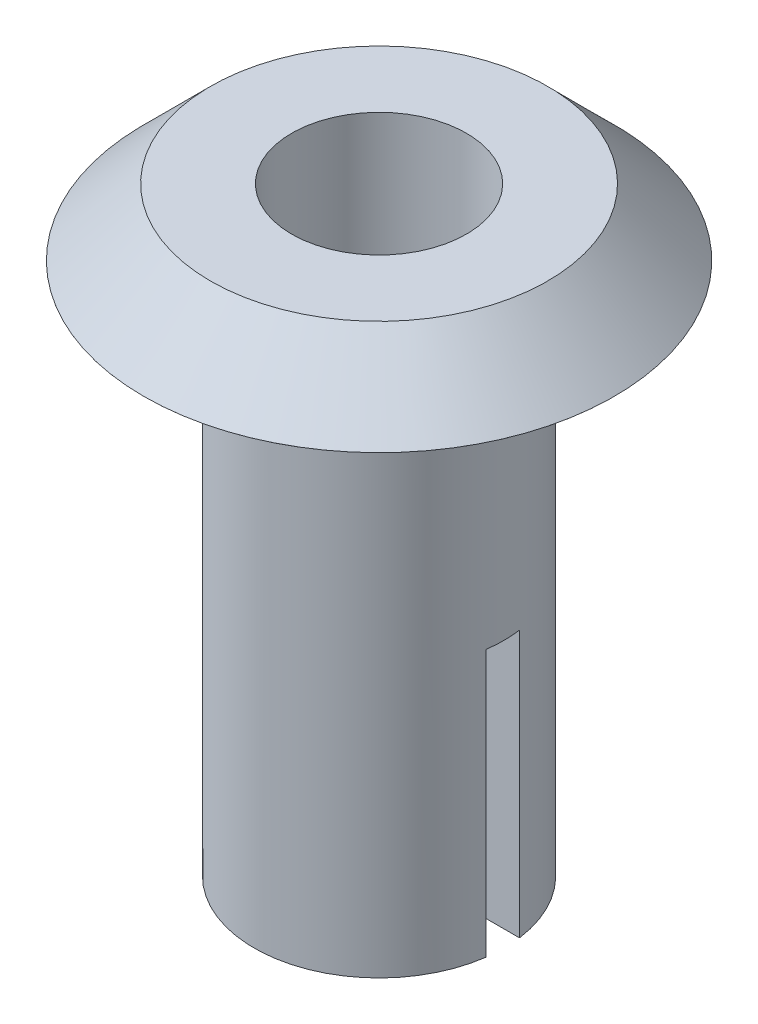
ISO-10303-21;
HEADER;
FILE_DESCRIPTION(('STEP AP214'),'2;1');
FILE_NAME('part.step','',(''),(''),'','','');
FILE_SCHEMA(('AUTOMOTIVE_DESIGN { 1 0 10303 214 1 1 1 1 }'));
ENDSEC;
DATA;
#1=APPLICATION_CONTEXT('core data for automotive mechanical design processes');
#2=APPLICATION_PROTOCOL_DEFINITION('international standard','automotive_design',2000,#1);
#3=PRODUCT_CONTEXT('',#1,'mechanical');
#4=PRODUCT('Part','Part','',(#3));
#5=PRODUCT_RELATED_PRODUCT_CATEGORY('part','',(#4));
#6=PRODUCT_DEFINITION_FORMATION('','',#4);
#7=PRODUCT_DEFINITION_CONTEXT('part definition',#1,'design');
#8=PRODUCT_DEFINITION('design','',#6,#7);
#9=PRODUCT_DEFINITION_SHAPE('','',#8);
#10=(LENGTH_UNIT() NAMED_UNIT(*) SI_UNIT(.MILLI.,.METRE.));
#11=(NAMED_UNIT(*) PLANE_ANGLE_UNIT() SI_UNIT($,.RADIAN.));
#12=(NAMED_UNIT(*) SI_UNIT($,.STERADIAN.) SOLID_ANGLE_UNIT());
#13=UNCERTAINTY_MEASURE_WITH_UNIT(LENGTH_MEASURE(1.E-05),#10,'distance_accuracy_value','');
#14=(GEOMETRIC_REPRESENTATION_CONTEXT(3) GLOBAL_UNCERTAINTY_ASSIGNED_CONTEXT((#13)) GLOBAL_UNIT_ASSIGNED_CONTEXT((#10,
#11,#12)) REPRESENTATION_CONTEXT('',''));
#15=CARTESIAN_POINT('',(0.,0.,0.));
#16=DIRECTION('',(0.,0.,1.));
#17=DIRECTION('',(1.,0.,0.));
#18=AXIS2_PLACEMENT_3D('',#15,#16,#17);
#19=CARTESIAN_POINT('',(0.,0.,0.));
#20=DIRECTION('',(0.,1.,0.));
#21=DIRECTION('',(0.,0.,1.));
#22=AXIS2_PLACEMENT_3D('',#19,#20,#21);
#23=PLANE('',#22);
#24=CARTESIAN_POINT('',(0.,0.,0.));
#25=DIRECTION('',(0.,1.,0.));
#26=DIRECTION('',(0.,0.,1.));
#27=AXIS2_PLACEMENT_3D('',#24,#25,#26);
#28=CIRCLE('',#27,1.5);
#29=CARTESIAN_POINT('',(1.48660687473185,0.,-0.2));
#30=VERTEX_POINT('',#29);
#31=CARTESIAN_POINT('',(-1.48660687473185,0.,-0.2));
#32=VERTEX_POINT('',#31);
#33=EDGE_CURVE('E131',#30,#32,#28,.T.);
#34=ORIENTED_EDGE('',*,*,#33,.F.);
#35=DIRECTION('',(1.,0.,0.));
#36=VECTOR('',#35,1.);
#37=CARTESIAN_POINT('',(-1.5,0.,-0.2));
#38=LINE('',#37,#36);
#39=EDGE_CURVE('E118',#32,#30,#38,.T.);
#40=ORIENTED_EDGE('',*,*,#39,.F.);
#41=EDGE_LOOP('',(#34,#40));
#42=FACE_BOUND('',#41,.T.);
#43=ADVANCED_FACE('F35',(#42),#23,.F.);
#44=CARTESIAN_POINT('',(0.,1.5001,0.));
#45=DIRECTION('',(0.,1.,0.));
#46=DIRECTION('',(0.,0.,1.));
#47=AXIS2_PLACEMENT_3D('',#44,#45,#46);
#48=PLANE('',#47);
#49=DIRECTION('',(-1.,0.,0.));
#50=VECTOR('',#49,1.);
#51=CARTESIAN_POINT('',(0.,1.5001,-0.2));
#52=LINE('',#51,#50);
#53=CARTESIAN_POINT('',(0.15,1.5001,-0.2));
#54=VERTEX_POINT('',#53);
#55=CARTESIAN_POINT('',(-0.150000000000001,1.50009999999999,-0.2));
#56=VERTEX_POINT('',#55);
#57=EDGE_CURVE('E128',#54,#56,#52,.T.);
#58=ORIENTED_EDGE('',*,*,#57,.F.);
#59=CARTESIAN_POINT('',(0.,1.5001,0.));
#60=DIRECTION('',(0.,1.,0.));
#61=DIRECTION('',(0.,0.,1.));
#62=AXIS2_PLACEMENT_3D('',#59,#60,#61);
#63=CIRCLE('',#62,0.25);
#64=EDGE_CURVE('E152',#54,#56,#63,.T.);
#65=ORIENTED_EDGE('',*,*,#64,.T.);
#66=EDGE_LOOP('',(#58,#65));
#67=FACE_BOUND('',#66,.T.);
#68=ADVANCED_FACE('F177',(#67),#48,.T.);
#69=CARTESIAN_POINT('',(0.,2.3001,0.));
#70=DIRECTION('',(0.,1.,0.));
#71=DIRECTION('',(0.,0.,1.));
#72=AXIS2_PLACEMENT_3D('',#69,#70,#71);
#73=DEGENERATE_TOROIDAL_SURFACE('',#72,0.25,0.8,.T.);
#74=ORIENTED_EDGE('',*,*,#64,.F.);
#75=CARTESIAN_POINT('',(0.,1.50166402886642,-0.2));
#76=CARTESIAN_POINT('',(0.0166698415826688,1.50166571667046,-0.2));
#77=CARTESIAN_POINT('',(0.0333398856129194,1.5015243846989,-0.2));
#78=CARTESIAN_POINT('',(0.0666781693266342,1.50108013124724,-0.2));
#79=CARTESIAN_POINT('',(0.0833464085193591,1.50077718944308,-0.2));
#80=CARTESIAN_POINT('',(0.1334092614839,1.50005060911422,-0.2));
#81=CARTESIAN_POINT('',(0.166812993914217,1.49981064587632,-0.2));
#82=CARTESIAN_POINT('',(0.229406412635807,1.50162846407508,-0.2));
#83=CARTESIAN_POINT('',(0.258601027229079,1.5034028341242,-0.2));
#84=CARTESIAN_POINT('',(0.316743266893158,1.50943838792807,-0.2));
#85=CARTESIAN_POINT('',(0.345690900061749,1.51369948982991,-0.2));
#86=CARTESIAN_POINT('',(0.402991969738191,1.52499097991025,-0.2));
#87=CARTESIAN_POINT('',(0.43134645596889,1.53201594533592,-0.2));
#88=CARTESIAN_POINT('',(0.487189985294854,1.54892644422566,-0.2));
#89=CARTESIAN_POINT('',(0.51467891698504,1.55881234426391,-0.2));
#90=CARTESIAN_POINT('',(0.583350982841369,1.58770457877812,-0.2));
#91=CARTESIAN_POINT('',(0.623707050723279,1.608732010134,-0.2));
#92=CARTESIAN_POINT('',(0.70034544039585,1.65728696231791,-0.2));
#93=CARTESIAN_POINT('',(0.736623667136238,1.68482093259039,-0.2));
#94=CARTESIAN_POINT('',(0.8039971339138,1.74568309567333,-0.2));
#95=CARTESIAN_POINT('',(0.835088877571679,1.77901516649863,-0.2));
#96=CARTESIAN_POINT('',(0.891088036855366,1.85049982703332,-0.2));
#97=CARTESIAN_POINT('',(0.91599833710029,1.88865015567519,-0.2));
#98=CARTESIAN_POINT('',(0.958481280077041,1.96790347324701,-0.2));
#99=CARTESIAN_POINT('',(0.976184281869382,2.00893663331438,-0.2));
#100=CARTESIAN_POINT('',(1.00439993048064,2.09340914612502,-0.2));
#101=CARTESIAN_POINT('',(1.01491219899784,2.13684862533388,-0.2));
#102=CARTESIAN_POINT('',(1.02838751393651,2.22458296266082,-0.2));
#103=CARTESIAN_POINT('',(1.03140084062819,2.26887010627033,-0.2));
#104=CARTESIAN_POINT('',(1.02993685654376,2.35732453651702,-0.2));
#105=CARTESIAN_POINT('',(1.02545891825336,2.40149181280298,-0.2));
#106=CARTESIAN_POINT('',(1.00915342271604,2.48838340979925,-0.2));
#107=CARTESIAN_POINT('',(0.997336178055473,2.5311096666496,-0.2));
#108=CARTESIAN_POINT('',(0.966713242045891,2.61395512181443,-0.2));
#109=CARTESIAN_POINT('',(0.947910965567331,2.6540755828194,-0.2));
#110=CARTESIAN_POINT('',(0.903839144046234,2.7306506914578,-0.2));
#111=CARTESIAN_POINT('',(0.878562317198208,2.76710114677823,-0.2));
#112=CARTESIAN_POINT('',(0.822245470323173,2.83532842733279,-0.2));
#113=CARTESIAN_POINT('',(0.791196792082228,2.86709810098077,-0.2));
#114=CARTESIAN_POINT('',(0.724008067566469,2.92527142435174,-0.2));
#115=CARTESIAN_POINT('',(0.687830871368458,2.95163214192628,-0.2));
#116=CARTESIAN_POINT('',(0.611776285106589,2.9979354345787,-0.2));
#117=CARTESIAN_POINT('',(0.571913327608463,3.01790178231344,-0.2));
#118=CARTESIAN_POINT('',(0.488698905847722,3.05152795161463,-0.2));
#119=CARTESIAN_POINT('',(0.445293861557957,3.06505457212068,-0.2));
#120=CARTESIAN_POINT('',(0.356717442684082,3.08530811915976,-0.2));
#121=CARTESIAN_POINT('',(0.311537986720364,3.09199895064935,-0.2));
#122=CARTESIAN_POINT('',(0.243810832825528,3.09765746387715,-0.2));
#123=CARTESIAN_POINT('',(0.221405555467714,3.09882104800239,-0.2));
#124=CARTESIAN_POINT('',(0.176559166379535,3.10008848768721,-0.2));
#125=CARTESIAN_POINT('',(0.154118045261469,3.10019199329407,-0.2));
#126=CARTESIAN_POINT('',(0.109196727516647,3.09986873007227,-0.2));
#127=CARTESIAN_POINT('',(0.0867165534580954,3.09944079485711,-0.2));
#128=CARTESIAN_POINT('',(0.0417602725450974,3.09876428051567,-0.2));
#129=CARTESIAN_POINT('',(0.0192841675849669,3.09851563069695,-0.2));
#130=CARTESIAN_POINT('',(-0.0256602785195891,3.0985594930865,-0.2));
#131=CARTESIAN_POINT('',(-0.0481286199316124,3.09885183940198,-0.2));
#132=CARTESIAN_POINT('',(-0.0930716344119246,3.09955118293042,-0.2));
#133=CARTESIAN_POINT('',(-0.115546306170629,3.09995822829499,-0.2));
#134=CARTESIAN_POINT('',(-0.160455392283717,3.10018035007008,-0.2));
#135=CARTESIAN_POINT('',(-0.182889787694873,3.09999671397185,-0.2));
#136=CARTESIAN_POINT('',(-0.227717260508836,3.09852636404797,-0.2));
#137=CARTESIAN_POINT('',(-0.250110352920595,3.09724019939141,-0.2));
#138=CARTESIAN_POINT('',(-0.296297968778293,3.09312072295697,-0.2));
#139=CARTESIAN_POINT('',(-0.320084183523528,3.09018810205309,-0.2));
#140=CARTESIAN_POINT('',(-0.367381071661446,3.08251258442502,-0.2));
#141=CARTESIAN_POINT('',(-0.390891486534654,3.07776811045488,-0.2));
#142=CARTESIAN_POINT('',(-0.460460798783884,3.06072186606951,-0.2));
#143=CARTESIAN_POINT('',(-0.505869337426221,3.04558316011647,-0.2));
#144=CARTESIAN_POINT('',(-0.593621321286191,3.00758337797835,-0.2));
#145=CARTESIAN_POINT('',(-0.635946841713136,2.98468093791962,-0.2));
#146=CARTESIAN_POINT('',(-0.716023573084662,2.93160345969393,-0.2));
#147=CARTESIAN_POINT('',(-0.753756166231605,2.90140021266384,-0.2));
#148=CARTESIAN_POINT('',(-0.82122693284102,2.83652498131007,-0.2));
#149=CARTESIAN_POINT('',(-0.85129133705298,2.80219152148355,-0.2));
#150=CARTESIAN_POINT('',(-0.905034875406045,2.72893181931438,-0.2));
#151=CARTESIAN_POINT('',(-0.928725093673388,2.69001372097015,-0.2));
#152=CARTESIAN_POINT('',(-0.968651849943626,2.60950280684566,-0.2));
#153=CARTESIAN_POINT('',(-0.985028556964881,2.5679794247673,-0.2));
#154=CARTESIAN_POINT('',(-1.01053977879569,2.48274183353331,-0.2));
#155=CARTESIAN_POINT('',(-1.01967100083736,2.43902663787444,-0.2));
#156=CARTESIAN_POINT('',(-1.03037488252278,2.35095439400306,-0.2));
#157=CARTESIAN_POINT('',(-1.0319936625118,2.30660294352136,-0.2));
#158=CARTESIAN_POINT('',(-1.02775164201873,2.21826517229983,-0.2));
#159=CARTESIAN_POINT('',(-1.0218918980028,2.17427880086995,-0.2));
#160=CARTESIAN_POINT('',(-1.00287715257568,2.08796873376396,-0.2));
#161=CARTESIAN_POINT('',(-0.989730984078272,2.0456430912738,-0.2));
#162=CARTESIAN_POINT('',(-0.956532739392012,1.9637942509764,-0.2));
#163=CARTESIAN_POINT('',(-0.936480727484413,1.92427102708769,-0.2));
#164=CARTESIAN_POINT('',(-0.89000930653147,1.84906071693307,-0.2));
#165=CARTESIAN_POINT('',(-0.863577783044371,1.81338111826882,-0.2));
#166=CARTESIAN_POINT('',(-0.805135950061446,1.74692476724934,-0.2));
#167=CARTESIAN_POINT('',(-0.773124960237336,1.71614861366918,-0.2));
#168=CARTESIAN_POINT('',(-0.704201964591778,1.66011251929112,-0.2));
#169=CARTESIAN_POINT('',(-0.667255690928788,1.63489475116404,-0.2));
#170=CARTESIAN_POINT('',(-0.589750741014979,1.59087804904981,-0.2));
#171=CARTESIAN_POINT('',(-0.549193354238049,1.5720768353066,-0.2));
#172=CARTESIAN_POINT('',(-0.464618124035503,1.54082506566216,-0.2));
#173=CARTESIAN_POINT('',(-0.420541481173459,1.52853355976589,-0.2));
#174=CARTESIAN_POINT('',(-0.353478204694671,1.51519374710883,-0.2));
#175=CARTESIAN_POINT('',(-0.330958738023759,1.51159639946551,-0.2));
#176=CARTESIAN_POINT('',(-0.285725184481576,1.50596298451672,-0.2));
#177=CARTESIAN_POINT('',(-0.263011112275252,1.50392680059455,-0.2));
#178=CARTESIAN_POINT('',(-0.220265046414644,1.50134704085338,-0.2));
#179=CARTESIAN_POINT('',(-0.200241187409336,1.50065263236869,-0.2));
#180=CARTESIAN_POINT('',(-0.160181956336417,1.50000890941707,-0.2));
#181=CARTESIAN_POINT('',(-0.140146582936294,1.50005971462649,-0.2));
#182=CARTESIAN_POINT('',(-0.100092386262173,1.50048895406501,-0.2));
#183=CARTESIAN_POINT('',(-0.0800735597774635,1.50086721965425,-0.2));
#184=CARTESIAN_POINT('',(-0.0400365856593522,1.50145372536468,-0.2));
#185=CARTESIAN_POINT('',(-0.0200184388052065,1.50166200202041,-0.2));
#186=CARTESIAN_POINT('',(0.,1.50166402886642,-0.2));
#187=B_SPLINE_CURVE_WITH_KNOTS('',3,(#75,#76,#77,#78,#79,#80,#81,#82,#83,#84,#85,#86,#87,#88,
#89,#90,#91,#92,#93,#94,#95,#96,#97,#98,#99,#100,#101,#102,#103,#104,#105,#106,#107,#108,#109,
#110,#111,#112,#113,#114,#115,#116,#117,#118,#119,#120,#121,#122,#123,#124,#125,#126,#127,#128,
#129,#130,#131,#132,#133,#134,#135,#136,#137,#138,#139,#140,#141,#142,#143,#144,#145,#146,#147,
#148,#149,#150,#151,#152,#153,#154,#155,#156,#157,#158,#159,#160,#161,#162,#163,#164,#165,#166,
#167,#168,#169,#170,#171,#172,#173,#174,#175,#176,#177,#178,#179,#180,#181,#182,#183,#184,#185,
#186),.UNSPECIFIED.,.T.,.F.,(4,2,2,2,2,2,2,2,2,2,2,2,2,2,2,2,2,2,2,2,2,2,2,2,2,2,2,2,2,2,2,2,2,
2,2,2,2,2,2,2,2,2,2,2,2,2,2,2,2,2,2,2,2,2,2,4),(0.,0.0500092875870138,0.100024865829181,
0.200203184706985,0.287861777597849,0.375517485293757,0.463002061677427,0.550497852506859,
0.686345267481207,0.822327906861565,0.958401849368154,1.09441217197756,1.22783965644739,
1.36127415994634,1.49381154741136,1.62636003757694,1.75872270162411,1.8910207406544,
2.02346823117991,2.15611603011067,2.28977910205329,2.42293931893524,2.55874556687355,
2.69526526367023,2.76254952674017,2.82985600094964,2.89731045831805,2.96473830375306,
3.03214547632458,3.09958098925381,3.16686961463669,3.23412474304008,3.3059556878525,
3.37784930567182,3.52070973803225,3.66434359216108,3.80854154820458,3.94478310926737,
4.08078620473342,4.21405728780716,4.34738890234448,4.4799008756818,4.61239413156609,
4.74472712366483,4.87705888400943,5.0096439421128,5.14224517820572,5.27582027582979,
5.40934786564635,5.54600276763964,5.6143717931752,5.68273571114481,5.74282493822376,
5.80292381533889,5.86299176034259,5.9230467919569),.UNSPECIFIED.);
#188=CARTESIAN_POINT('',(1.03077640640442,2.3001,-0.2));
#189=VERTEX_POINT('',#188);
#190=EDGE_CURVE('E253',#54,#189,#187,.T.);
#191=ORIENTED_EDGE('',*,*,#190,.T.);
#192=CARTESIAN_POINT('',(0.,2.3001,0.));
#193=DIRECTION('',(0.,1.,0.));
#194=DIRECTION('',(0.,0.,1.));
#195=AXIS2_PLACEMENT_3D('',#192,#193,#194);
#196=CIRCLE('',#195,1.05);
#197=CARTESIAN_POINT('',(-1.03077640641938,2.30010000000522,-0.2));
#198=VERTEX_POINT('',#197);
#199=EDGE_CURVE('E156',#198,#189,#196,.F.);
#200=ORIENTED_EDGE('',*,*,#199,.F.);
#201=EDGE_CURVE('E162',#198,#56,#187,.T.);
#202=ORIENTED_EDGE('',*,*,#201,.T.);
#203=EDGE_LOOP('',(#74,#191,#200,#202));
#204=FACE_BOUND('',#203,.T.);
#205=ADVANCED_FACE('F197',(#204),#73,.F.);
#206=CARTESIAN_POINT('',(0.,7.2,0.));
#207=DIRECTION('',(0.,-1.,0.));
#208=DIRECTION('',(0.,0.,-1.));
#209=AXIS2_PLACEMENT_3D('',#206,#207,#208);
#210=CYLINDRICAL_SURFACE('',#209,1.5);
#211=CARTESIAN_POINT('',(0.,3.2,0.));
#212=DIRECTION('',(0.,-1.,0.));
#213=DIRECTION('',(0.,0.,-1.));
#214=AXIS2_PLACEMENT_3D('',#211,#212,#213);
#215=CIRCLE('',#214,1.5);
#216=CARTESIAN_POINT('',(1.48660687473185,3.2,-0.2));
#217=VERTEX_POINT('',#216);
#218=CARTESIAN_POINT('',(1.48660687473185,3.2,0.2));
#219=VERTEX_POINT('',#218);
#220=EDGE_CURVE('E215',#217,#219,#215,.T.);
#221=ORIENTED_EDGE('',*,*,#220,.F.);
#222=DIRECTION('',(0.,-1.,0.));
#223=VECTOR('',#222,1.);
#224=CARTESIAN_POINT('',(1.48660687473185,7.2,-0.2));
#225=LINE('',#224,#223);
#226=EDGE_CURVE('E214',#217,#30,#225,.T.);
#227=ORIENTED_EDGE('',*,*,#226,.T.);
#228=ORIENTED_EDGE('',*,*,#33,.T.);
#229=DIRECTION('',(0.,-1.,0.));
#230=VECTOR('',#229,1.);
#231=CARTESIAN_POINT('',(-1.48660687473185,7.2,-0.2));
#232=LINE('',#231,#230);
#233=CARTESIAN_POINT('',(-1.48660687473185,3.2,-0.2));
#234=VERTEX_POINT('',#233);
#235=EDGE_CURVE('E213',#32,#234,#232,.F.);
#236=ORIENTED_EDGE('',*,*,#235,.T.);
#237=CARTESIAN_POINT('',(-1.48660687473185,3.2,0.2));
#238=VERTEX_POINT('',#237);
#239=EDGE_CURVE('E127',#238,#234,#215,.T.);
#240=ORIENTED_EDGE('',*,*,#239,.F.);
#241=DIRECTION('',(0.,-1.,0.));
#242=VECTOR('',#241,1.);
#243=CARTESIAN_POINT('',(-1.48660687473185,7.2,0.2));
#244=LINE('',#243,#242);
#245=CARTESIAN_POINT('',(-1.48660687473185,0.,0.2));
#246=VERTEX_POINT('',#245);
#247=EDGE_CURVE('E113',#238,#246,#244,.T.);
#248=ORIENTED_EDGE('',*,*,#247,.T.);
#249=CARTESIAN_POINT('',(1.48660687473185,0.,0.2));
#250=VERTEX_POINT('',#249);
#251=EDGE_CURVE('E125',#246,#250,#28,.T.);
#252=ORIENTED_EDGE('',*,*,#251,.T.);
#253=DIRECTION('',(0.,-1.,0.));
#254=VECTOR('',#253,1.);
#255=CARTESIAN_POINT('',(1.48660687473185,7.2,0.2));
#256=LINE('',#255,#254);
#257=EDGE_CURVE('E51',#250,#219,#256,.F.);
#258=ORIENTED_EDGE('',*,*,#257,.T.);
#259=EDGE_LOOP('',(#221,#227,#228,#236,#240,#248,#252,#258));
#260=FACE_BOUND('',#259,.T.);
#261=CARTESIAN_POINT('',(0.,6.4,0.));
#262=DIRECTION('',(0.,1.,0.));
#263=DIRECTION('',(0.,0.,1.));
#264=AXIS2_PLACEMENT_3D('',#261,#262,#263);
#265=CIRCLE('',#264,1.5);
#266=CARTESIAN_POINT('',(0.,6.4,1.5));
#267=VERTEX_POINT('',#266);
#268=EDGE_CURVE('E135',#267,#267,#265,.T.);
#269=ORIENTED_EDGE('',*,*,#268,.F.);
#270=EDGE_LOOP('',(#269));
#271=FACE_BOUND('',#270,.T.);
#272=ADVANCED_FACE('F123',(#260,#271),#210,.T.);
#273=ORIENTED_EDGE('',*,*,#251,.F.);
#274=DIRECTION('',(-1.,0.,0.));
#275=VECTOR('',#274,1.);
#276=CARTESIAN_POINT('',(-1.5,0.,0.2));
#277=LINE('',#276,#275);
#278=EDGE_CURVE('E109',#250,#246,#277,.T.);
#279=ORIENTED_EDGE('',*,*,#278,.F.);
#280=EDGE_LOOP('',(#273,#279));
#281=FACE_BOUND('',#280,.T.);
#282=ADVANCED_FACE('F130',(#281),#23,.F.);
#283=CARTESIAN_POINT('',(0.,6.4,0.));
#284=DIRECTION('',(0.,1.,0.));
#285=DIRECTION('',(0.,0.,1.));
#286=AXIS2_PLACEMENT_3D('',#283,#284,#285);
#287=PLANE('',#286);
#288=CARTESIAN_POINT('',(0.,6.4,0.));
#289=DIRECTION('',(0.,1.,0.));
#290=DIRECTION('',(0.,0.,1.));
#291=AXIS2_PLACEMENT_3D('',#288,#289,#290);
#292=CIRCLE('',#291,2.825);
#293=CARTESIAN_POINT('',(0.,6.4,2.825));
#294=VERTEX_POINT('',#293);
#295=EDGE_CURVE('E132',#294,#294,#292,.T.);
#296=ORIENTED_EDGE('',*,*,#295,.F.);
#297=EDGE_LOOP('',(#296));
#298=FACE_BOUND('',#297,.T.);
#299=ORIENTED_EDGE('',*,*,#268,.T.);
#300=EDGE_LOOP('',(#299));
#301=FACE_BOUND('',#300,.T.);
#302=ADVANCED_FACE('F187',(#298,#301),#287,.F.);
#303=CARTESIAN_POINT('',(0.,6.4,0.));
#304=DIRECTION('',(0.,1.,0.));
#305=DIRECTION('',(0.,0.,1.));
#306=AXIS2_PLACEMENT_3D('',#303,#304,#305);
#307=CYLINDRICAL_SURFACE('',#306,2.825);
#308=CARTESIAN_POINT('',(0.,6.4001,0.));
#309=DIRECTION('',(0.,1.,0.));
#310=DIRECTION('',(0.,0.,1.));
#311=AXIS2_PLACEMENT_3D('',#308,#309,#310);
#312=CIRCLE('',#311,2.825);
#313=CARTESIAN_POINT('',(0.,6.4001,2.825));
#314=VERTEX_POINT('',#313);
#315=EDGE_CURVE('E146',#314,#314,#312,.F.);
#316=ORIENTED_EDGE('',*,*,#315,.T.);
#317=EDGE_LOOP('',(#316));
#318=FACE_BOUND('',#317,.T.);
#319=ORIENTED_EDGE('',*,*,#295,.T.);
#320=EDGE_LOOP('',(#319));
#321=FACE_BOUND('',#320,.T.);
#322=ADVANCED_FACE('F185',(#318,#321),#307,.T.);
#323=CARTESIAN_POINT('',(0.,7.2001,0.));
#324=DIRECTION('',(0.,1.,0.));
#325=DIRECTION('',(0.,0.,1.));
#326=AXIS2_PLACEMENT_3D('',#323,#324,#325);
#327=PLANE('',#326);
#328=CARTESIAN_POINT('',(0.,7.2001,0.));
#329=DIRECTION('',(0.,1.,0.));
#330=DIRECTION('',(0.,0.,1.));
#331=AXIS2_PLACEMENT_3D('',#328,#329,#330);
#332=CIRCLE('',#331,1.05);
#333=CARTESIAN_POINT('',(0.,7.2001,1.05));
#334=VERTEX_POINT('',#333);
#335=EDGE_CURVE('E137',#334,#334,#332,.T.);
#336=ORIENTED_EDGE('',*,*,#335,.F.);
#337=EDGE_LOOP('',(#336));
#338=FACE_BOUND('',#337,.T.);
#339=CARTESIAN_POINT('',(0.,7.2001,0.));
#340=DIRECTION('',(0.,1.,0.));
#341=DIRECTION('',(0.,0.,1.));
#342=AXIS2_PLACEMENT_3D('',#339,#340,#341);
#343=CIRCLE('',#342,2.025);
#344=CARTESIAN_POINT('',(0.,7.2001,2.025));
#345=VERTEX_POINT('',#344);
#346=EDGE_CURVE('E143',#345,#345,#343,.T.);
#347=ORIENTED_EDGE('',*,*,#346,.T.);
#348=EDGE_LOOP('',(#347));
#349=FACE_BOUND('',#348,.T.);
#350=ADVANCED_FACE('F182',(#338,#349),#327,.T.);
#351=CARTESIAN_POINT('',(0.,7.2001,0.));
#352=DIRECTION('',(0.,-1.,0.));
#353=DIRECTION('',(0.,0.,-1.));
#354=AXIS2_PLACEMENT_3D('',#351,#352,#353);
#355=CONICAL_SURFACE('',#354,2.025,0.785398163397447);
#356=ORIENTED_EDGE('',*,*,#315,.F.);
#357=EDGE_LOOP('',(#356));
#358=FACE_BOUND('',#357,.T.);
#359=ORIENTED_EDGE('',*,*,#346,.F.);
#360=EDGE_LOOP('',(#359));
#361=FACE_BOUND('',#360,.T.);
#362=ADVANCED_FACE('F180',(#358,#361),#355,.T.);
#363=CARTESIAN_POINT('',(0.,1.5001,0.));
#364=DIRECTION('',(0.,1.,0.));
#365=DIRECTION('',(0.,0.,1.));
#366=AXIS2_PLACEMENT_3D('',#363,#364,#365);
#367=CYLINDRICAL_SURFACE('',#366,1.05);
#368=CARTESIAN_POINT('',(0.,3.2,0.));
#369=DIRECTION('',(0.,-1.,0.));
#370=DIRECTION('',(0.,0.,-1.));
#371=AXIS2_PLACEMENT_3D('',#368,#369,#370);
#372=CIRCLE('',#371,1.05);
#373=CARTESIAN_POINT('',(-1.03077640640442,3.2,-0.2));
#374=VERTEX_POINT('',#373);
#375=CARTESIAN_POINT('',(-1.03077640640442,3.2,0.2));
#376=VERTEX_POINT('',#375);
#377=EDGE_CURVE('E11',#374,#376,#372,.F.);
#378=ORIENTED_EDGE('',*,*,#377,.F.);
#379=DIRECTION('',(0.,1.,0.));
#380=VECTOR('',#379,1.);
#381=CARTESIAN_POINT('',(-1.03077640640442,1.5001,-0.2));
#382=LINE('',#381,#380);
#383=EDGE_CURVE('E246',#374,#198,#382,.F.);
#384=ORIENTED_EDGE('',*,*,#383,.T.);
#385=ORIENTED_EDGE('',*,*,#199,.T.);
#386=DIRECTION('',(0.,1.,0.));
#387=VECTOR('',#386,1.);
#388=CARTESIAN_POINT('',(1.03077640640442,1.5001,-0.2));
#389=LINE('',#388,#387);
#390=CARTESIAN_POINT('',(1.03077640640442,3.2,-0.2));
#391=VERTEX_POINT('',#390);
#392=EDGE_CURVE('E221',#189,#391,#389,.T.);
#393=ORIENTED_EDGE('',*,*,#392,.T.);
#394=CARTESIAN_POINT('',(1.03077640640442,3.2,0.2));
#395=VERTEX_POINT('',#394);
#396=EDGE_CURVE('E40',#395,#391,#372,.F.);
#397=ORIENTED_EDGE('',*,*,#396,.F.);
#398=DIRECTION('',(0.,1.,0.));
#399=VECTOR('',#398,1.);
#400=CARTESIAN_POINT('',(1.03077640640442,1.5001,0.2));
#401=LINE('',#400,#399);
#402=CARTESIAN_POINT('',(1.03077640641938,2.30010000000522,0.2));
#403=VERTEX_POINT('',#402);
#404=EDGE_CURVE('E236',#395,#403,#401,.F.);
#405=ORIENTED_EDGE('',*,*,#404,.T.);
#406=CARTESIAN_POINT('',(-1.03077640640442,2.3001,0.2));
#407=VERTEX_POINT('',#406);
#408=EDGE_CURVE('E153',#403,#407,#196,.F.);
#409=ORIENTED_EDGE('',*,*,#408,.T.);
#410=DIRECTION('',(0.,1.,0.));
#411=VECTOR('',#410,1.);
#412=CARTESIAN_POINT('',(-1.03077640640442,1.5001,0.2));
#413=LINE('',#412,#411);
#414=EDGE_CURVE('E239',#407,#376,#413,.T.);
#415=ORIENTED_EDGE('',*,*,#414,.T.);
#416=EDGE_LOOP('',(#378,#384,#385,#393,#397,#405,#409,#415));
#417=FACE_BOUND('',#416,.T.);
#418=ORIENTED_EDGE('',*,*,#335,.T.);
#419=EDGE_LOOP('',(#418));
#420=FACE_BOUND('',#419,.T.);
#421=ADVANCED_FACE('F175',(#417,#420),#367,.F.);
#422=DIRECTION('',(1.,0.,0.));
#423=VECTOR('',#422,1.);
#424=CARTESIAN_POINT('',(0.,1.5001,0.2));
#425=LINE('',#424,#423);
#426=CARTESIAN_POINT('',(-0.15,1.5001,0.2));
#427=VERTEX_POINT('',#426);
#428=CARTESIAN_POINT('',(0.15,1.5001,0.2));
#429=VERTEX_POINT('',#428);
#430=EDGE_CURVE('E58',#427,#429,#425,.T.);
#431=ORIENTED_EDGE('',*,*,#430,.F.);
#432=EDGE_CURVE('E149',#427,#429,#63,.T.);
#433=ORIENTED_EDGE('',*,*,#432,.T.);
#434=EDGE_LOOP('',(#431,#433));
#435=FACE_BOUND('',#434,.T.);
#436=ADVANCED_FACE('F172',(#435),#48,.T.);
#437=ORIENTED_EDGE('',*,*,#432,.F.);
#438=CARTESIAN_POINT('',(0.,1.50166402886642,0.2));
#439=CARTESIAN_POINT('',(-0.0166698415826688,1.50166571667046,0.2));
#440=CARTESIAN_POINT('',(-0.0333398856129194,1.5015243846989,0.2));
#441=CARTESIAN_POINT('',(-0.0666781693266342,1.50108013124724,0.2));
#442=CARTESIAN_POINT('',(-0.0833464085193591,1.50077718944308,0.2));
#443=CARTESIAN_POINT('',(-0.1334092614839,1.50005060911422,0.2));
#444=CARTESIAN_POINT('',(-0.166812993914217,1.49981064587632,0.2));
#445=CARTESIAN_POINT('',(-0.229406412635807,1.50162846407508,0.2));
#446=CARTESIAN_POINT('',(-0.258601027229079,1.5034028341242,0.2));
#447=CARTESIAN_POINT('',(-0.316743266893158,1.50943838792807,0.2));
#448=CARTESIAN_POINT('',(-0.345690900061749,1.51369948982991,0.2));
#449=CARTESIAN_POINT('',(-0.402991969738191,1.52499097991025,0.2));
#450=CARTESIAN_POINT('',(-0.43134645596889,1.53201594533592,0.2));
#451=CARTESIAN_POINT('',(-0.487189985294854,1.54892644422566,0.2));
#452=CARTESIAN_POINT('',(-0.51467891698504,1.55881234426391,0.2));
#453=CARTESIAN_POINT('',(-0.583350982841369,1.58770457877812,0.2));
#454=CARTESIAN_POINT('',(-0.623707050723279,1.608732010134,0.2));
#455=CARTESIAN_POINT('',(-0.70034544039585,1.65728696231791,0.2));
#456=CARTESIAN_POINT('',(-0.736623667136238,1.68482093259039,0.2));
#457=CARTESIAN_POINT('',(-0.8039971339138,1.74568309567333,0.2));
#458=CARTESIAN_POINT('',(-0.835088877571679,1.77901516649863,0.2));
#459=CARTESIAN_POINT('',(-0.891088036855366,1.85049982703332,0.2));
#460=CARTESIAN_POINT('',(-0.91599833710029,1.88865015567519,0.2));
#461=CARTESIAN_POINT('',(-0.958481280077041,1.96790347324701,0.2));
#462=CARTESIAN_POINT('',(-0.976184281869382,2.00893663331438,0.2));
#463=CARTESIAN_POINT('',(-1.00439993048064,2.09340914612502,0.2));
#464=CARTESIAN_POINT('',(-1.01491219899784,2.13684862533388,0.2));
#465=CARTESIAN_POINT('',(-1.02838751393651,2.22458296266082,0.2));
#466=CARTESIAN_POINT('',(-1.03140084062819,2.26887010627033,0.2));
#467=CARTESIAN_POINT('',(-1.02993685654376,2.35732453651702,0.2));
#468=CARTESIAN_POINT('',(-1.02545891825336,2.40149181280298,0.2));
#469=CARTESIAN_POINT('',(-1.00915342271604,2.48838340979925,0.2));
#470=CARTESIAN_POINT('',(-0.997336178055473,2.5311096666496,0.2));
#471=CARTESIAN_POINT('',(-0.966713242045891,2.61395512181443,0.2));
#472=CARTESIAN_POINT('',(-0.94791096556733,2.6540755828194,0.2));
#473=CARTESIAN_POINT('',(-0.903839144046234,2.7306506914578,0.2));
#474=CARTESIAN_POINT('',(-0.878562317198208,2.76710114677823,0.2));
#475=CARTESIAN_POINT('',(-0.822245470323173,2.83532842733279,0.2));
#476=CARTESIAN_POINT('',(-0.791196792082228,2.86709810098076,0.2));
#477=CARTESIAN_POINT('',(-0.724008067566469,2.92527142435174,0.2));
#478=CARTESIAN_POINT('',(-0.687830871368458,2.95163214192628,0.2));
#479=CARTESIAN_POINT('',(-0.611776285106589,2.9979354345787,0.2));
#480=CARTESIAN_POINT('',(-0.571913327608463,3.01790178231344,0.2));
#481=CARTESIAN_POINT('',(-0.488698905847722,3.05152795161463,0.2));
#482=CARTESIAN_POINT('',(-0.445293861557956,3.06505457212068,0.2));
#483=CARTESIAN_POINT('',(-0.356717442684082,3.08530811915976,0.2));
#484=CARTESIAN_POINT('',(-0.311537986720364,3.09199895064935,0.2));
#485=CARTESIAN_POINT('',(-0.243810832825528,3.09765746387715,0.2));
#486=CARTESIAN_POINT('',(-0.221405555467714,3.09882104800239,0.2));
#487=CARTESIAN_POINT('',(-0.176559166379535,3.10008848768721,0.2));
#488=CARTESIAN_POINT('',(-0.154118045261469,3.10019199329407,0.2));
#489=CARTESIAN_POINT('',(-0.109196727516647,3.09986873007227,0.2));
#490=CARTESIAN_POINT('',(-0.0867165534580955,3.09944079485711,0.2));
#491=CARTESIAN_POINT('',(-0.0417602725450975,3.09876428051567,0.2));
#492=CARTESIAN_POINT('',(-0.019284167584967,3.09851563069695,0.2));
#493=CARTESIAN_POINT('',(0.0256602785195889,3.0985594930865,0.2));
#494=CARTESIAN_POINT('',(0.0481286199316123,3.09885183940198,0.2));
#495=CARTESIAN_POINT('',(0.0930716344119245,3.09955118293042,0.2));
#496=CARTESIAN_POINT('',(0.115546306170629,3.09995822829499,0.2));
#497=CARTESIAN_POINT('',(0.160455392283717,3.10018035007008,0.2));
#498=CARTESIAN_POINT('',(0.182889787694872,3.09999671397185,0.2));
#499=CARTESIAN_POINT('',(0.227717260508836,3.09852636404797,0.2));
#500=CARTESIAN_POINT('',(0.250110352920595,3.09724019939141,0.2));
#501=CARTESIAN_POINT('',(0.296297968778293,3.09312072295697,0.2));
#502=CARTESIAN_POINT('',(0.320084183523528,3.09018810205309,0.2));
#503=CARTESIAN_POINT('',(0.367381071661446,3.08251258442502,0.2));
#504=CARTESIAN_POINT('',(0.390891486534654,3.07776811045488,0.2));
#505=CARTESIAN_POINT('',(0.460460798783883,3.06072186606951,0.2));
#506=CARTESIAN_POINT('',(0.50586933742622,3.04558316011647,0.2));
#507=CARTESIAN_POINT('',(0.593621321286191,3.00758337797835,0.2));
#508=CARTESIAN_POINT('',(0.635946841713136,2.98468093791962,0.2));
#509=CARTESIAN_POINT('',(0.716023573084662,2.93160345969393,0.2));
#510=CARTESIAN_POINT('',(0.753756166231605,2.90140021266384,0.2));
#511=CARTESIAN_POINT('',(0.82122693284102,2.83652498131007,0.2));
#512=CARTESIAN_POINT('',(0.85129133705298,2.80219152148355,0.2));
#513=CARTESIAN_POINT('',(0.905034875406046,2.72893181931438,0.2));
#514=CARTESIAN_POINT('',(0.928725093673388,2.69001372097015,0.2));
#515=CARTESIAN_POINT('',(0.968651849943626,2.60950280684566,0.2));
#516=CARTESIAN_POINT('',(0.985028556964881,2.5679794247673,0.2));
#517=CARTESIAN_POINT('',(1.01053977879569,2.48274183353331,0.2));
#518=CARTESIAN_POINT('',(1.01967100083736,2.43902663787444,0.2));
#519=CARTESIAN_POINT('',(1.03037488252278,2.35095439400307,0.2));
#520=CARTESIAN_POINT('',(1.0319936625118,2.30660294352136,0.2));
#521=CARTESIAN_POINT('',(1.02775164201873,2.21826517229983,0.2));
#522=CARTESIAN_POINT('',(1.0218918980028,2.17427880086995,0.2));
#523=CARTESIAN_POINT('',(1.00287715257568,2.08796873376396,0.2));
#524=CARTESIAN_POINT('',(0.989730984078273,2.0456430912738,0.2));
#525=CARTESIAN_POINT('',(0.956532739392012,1.9637942509764,0.2));
#526=CARTESIAN_POINT('',(0.936480727484413,1.92427102708769,0.2));
#527=CARTESIAN_POINT('',(0.89000930653147,1.84906071693307,0.2));
#528=CARTESIAN_POINT('',(0.863577783044371,1.81338111826882,0.2));
#529=CARTESIAN_POINT('',(0.805135950061446,1.74692476724934,0.2));
#530=CARTESIAN_POINT('',(0.773124960237336,1.71614861366918,0.2));
#531=CARTESIAN_POINT('',(0.704201964591778,1.66011251929112,0.2));
#532=CARTESIAN_POINT('',(0.667255690928788,1.63489475116404,0.2));
#533=CARTESIAN_POINT('',(0.589750741014979,1.59087804904981,0.2));
#534=CARTESIAN_POINT('',(0.54919335423805,1.5720768353066,0.2));
#535=CARTESIAN_POINT('',(0.464618124035503,1.54082506566216,0.2));
#536=CARTESIAN_POINT('',(0.420541481173459,1.52853355976589,0.2));
#537=CARTESIAN_POINT('',(0.353478204694671,1.51519374710883,0.2));
#538=CARTESIAN_POINT('',(0.330958738023759,1.51159639946551,0.2));
#539=CARTESIAN_POINT('',(0.285725184481576,1.50596298451672,0.2));
#540=CARTESIAN_POINT('',(0.263011112275252,1.50392680059455,0.2));
#541=CARTESIAN_POINT('',(0.220265046414644,1.50134704085338,0.2));
#542=CARTESIAN_POINT('',(0.200241187409337,1.50065263236869,0.2));
#543=CARTESIAN_POINT('',(0.160181956336417,1.50000890941707,0.2));
#544=CARTESIAN_POINT('',(0.140146582936295,1.50005971462649,0.2));
#545=CARTESIAN_POINT('',(0.100092386262173,1.50048895406501,0.2));
#546=CARTESIAN_POINT('',(0.0800735597774638,1.50086721965425,0.2));
#547=CARTESIAN_POINT('',(0.0400365856593522,1.50145372536468,0.2));
#548=CARTESIAN_POINT('',(0.0200184388052065,1.50166200202041,0.2));
#549=CARTESIAN_POINT('',(0.,1.50166402886642,0.2));
#550=B_SPLINE_CURVE_WITH_KNOTS('',3,(#438,#439,#440,#441,#442,#443,#444,#445,#446,#447,#448,
#449,#450,#451,#452,#453,#454,#455,#456,#457,#458,#459,#460,#461,#462,#463,#464,#465,#466,#467,
#468,#469,#470,#471,#472,#473,#474,#475,#476,#477,#478,#479,#480,#481,#482,#483,#484,#485,#486,
#487,#488,#489,#490,#491,#492,#493,#494,#495,#496,#497,#498,#499,#500,#501,#502,#503,#504,#505,
#506,#507,#508,#509,#510,#511,#512,#513,#514,#515,#516,#517,#518,#519,#520,#521,#522,#523,#524,
#525,#526,#527,#528,#529,#530,#531,#532,#533,#534,#535,#536,#537,#538,#539,#540,#541,#542,#543,
#544,#545,#546,#547,#548,#549),.UNSPECIFIED.,.T.,.F.,(4,2,2,2,2,2,2,2,2,2,2,2,2,2,2,2,2,2,2,2,2,
2,2,2,2,2,2,2,2,2,2,2,2,2,2,2,2,2,2,2,2,2,2,2,2,2,2,2,2,2,2,2,2,2,2,4),(0.,0.0500092875870138,
0.100024865829181,0.200203184706985,0.287861777597849,0.375517485293757,0.463002061677427,
0.550497852506859,0.686345267481207,0.822327906861565,0.958401849368154,1.09441217197756,
1.22783965644739,1.36127415994634,1.49381154741136,1.62636003757694,1.75872270162411,
1.8910207406544,2.02346823117991,2.15611603011067,2.28977910205329,2.42293931893524,
2.55874556687355,2.69526526367023,2.76254952674017,2.82985600094964,2.89731045831805,
2.96473830375306,3.03214547632458,3.09958098925381,3.16686961463669,3.23412474304008,
3.3059556878525,3.37784930567182,3.52070973803225,3.66434359216108,3.80854154820458,
3.94478310926737,4.08078620473341,4.21405728780716,4.34738890234448,4.4799008756818,
4.61239413156609,4.74472712366483,4.87705888400943,5.00964394211279,5.14224517820572,
5.27582027582979,5.40934786564634,5.54600276763964,5.6143717931752,5.68273571114481,
5.74282493822376,5.80292381533889,5.86299176034259,5.9230467919569),.UNSPECIFIED.);
#551=EDGE_CURVE('E161',#427,#407,#550,.T.);
#552=ORIENTED_EDGE('',*,*,#551,.T.);
#553=ORIENTED_EDGE('',*,*,#408,.F.);
#554=EDGE_CURVE('E157',#403,#429,#550,.T.);
#555=ORIENTED_EDGE('',*,*,#554,.T.);
#556=EDGE_LOOP('',(#437,#552,#553,#555));
#557=FACE_BOUND('',#556,.T.);
#558=ADVANCED_FACE('F37',(#557),#73,.F.);
#559=CARTESIAN_POINT('',(0.,3.2,0.));
#560=DIRECTION('',(0.,-1.,0.));
#561=DIRECTION('',(0.,0.,-1.));
#562=AXIS2_PLACEMENT_3D('',#559,#560,#561);
#563=PLANE('',#562);
#564=ORIENTED_EDGE('',*,*,#220,.T.);
#565=DIRECTION('',(-1.,0.,0.));
#566=VECTOR('',#565,1.);
#567=CARTESIAN_POINT('',(-1.5,3.2,0.2));
#568=LINE('',#567,#566);
#569=EDGE_CURVE('E232',#219,#395,#568,.T.);
#570=ORIENTED_EDGE('',*,*,#569,.T.);
#571=ORIENTED_EDGE('',*,*,#396,.T.);
#572=DIRECTION('',(1.,0.,0.));
#573=VECTOR('',#572,1.);
#574=CARTESIAN_POINT('',(-1.5,3.2,-0.2));
#575=LINE('',#574,#573);
#576=EDGE_CURVE('E234',#391,#217,#575,.T.);
#577=ORIENTED_EDGE('',*,*,#576,.T.);
#578=EDGE_LOOP('',(#564,#570,#571,#577));
#579=FACE_BOUND('',#578,.T.);
#580=ADVANCED_FACE('F231',(#579),#563,.T.);
#581=ORIENTED_EDGE('',*,*,#239,.T.);
#582=EDGE_CURVE('E263',#234,#374,#575,.T.);
#583=ORIENTED_EDGE('',*,*,#582,.T.);
#584=ORIENTED_EDGE('',*,*,#377,.T.);
#585=EDGE_CURVE('E237',#376,#238,#568,.T.);
#586=ORIENTED_EDGE('',*,*,#585,.T.);
#587=EDGE_LOOP('',(#581,#583,#584,#586));
#588=FACE_BOUND('',#587,.T.);
#589=ADVANCED_FACE('F268',(#588),#563,.T.);
#590=CARTESIAN_POINT('',(-1.5,3.2,-0.2));
#591=DIRECTION('',(0.,0.,-1.));
#592=DIRECTION('',(-1.,0.,0.));
#593=AXIS2_PLACEMENT_3D('',#590,#591,#592);
#594=PLANE('',#593);
#595=ORIENTED_EDGE('',*,*,#576,.F.);
#596=ORIENTED_EDGE('',*,*,#392,.F.);
#597=ORIENTED_EDGE('',*,*,#190,.F.);
#598=ORIENTED_EDGE('',*,*,#57,.T.);
#599=ORIENTED_EDGE('',*,*,#201,.F.);
#600=ORIENTED_EDGE('',*,*,#383,.F.);
#601=ORIENTED_EDGE('',*,*,#582,.F.);
#602=ORIENTED_EDGE('',*,*,#235,.F.);
#603=ORIENTED_EDGE('',*,*,#39,.T.);
#604=ORIENTED_EDGE('',*,*,#226,.F.);
#605=EDGE_LOOP('',(#595,#596,#597,#598,#599,#600,#601,#602,#603,#604));
#606=FACE_BOUND('',#605,.T.);
#607=ADVANCED_FACE('F169',(#606),#594,.F.);
#608=CARTESIAN_POINT('',(-1.5,3.2,0.2));
#609=DIRECTION('',(0.,0.,1.));
#610=DIRECTION('',(1.,0.,0.));
#611=AXIS2_PLACEMENT_3D('',#608,#609,#610);
#612=PLANE('',#611);
#613=ORIENTED_EDGE('',*,*,#585,.F.);
#614=ORIENTED_EDGE('',*,*,#414,.F.);
#615=ORIENTED_EDGE('',*,*,#551,.F.);
#616=ORIENTED_EDGE('',*,*,#430,.T.);
#617=ORIENTED_EDGE('',*,*,#554,.F.);
#618=ORIENTED_EDGE('',*,*,#404,.F.);
#619=ORIENTED_EDGE('',*,*,#569,.F.);
#620=ORIENTED_EDGE('',*,*,#257,.F.);
#621=ORIENTED_EDGE('',*,*,#278,.T.);
#622=ORIENTED_EDGE('',*,*,#247,.F.);
#623=EDGE_LOOP('',(#613,#614,#615,#616,#617,#618,#619,#620,#621,#622));
#624=FACE_BOUND('',#623,.T.);
#625=ADVANCED_FACE('F112',(#624),#612,.F.);
#626=CLOSED_SHELL('',(#43,#68,#205,#272,#282,#302,#322,#350,#362,#421,#436,#558,#580,#589,#607,#625));
#627=MANIFOLD_SOLID_BREP('B2',#626);
#628=ADVANCED_BREP_SHAPE_REPRESENTATION('',(#18,#627),#14);
#629=SHAPE_DEFINITION_REPRESENTATION(#9,#628);
ENDSEC;
END-ISO-10303-21;
